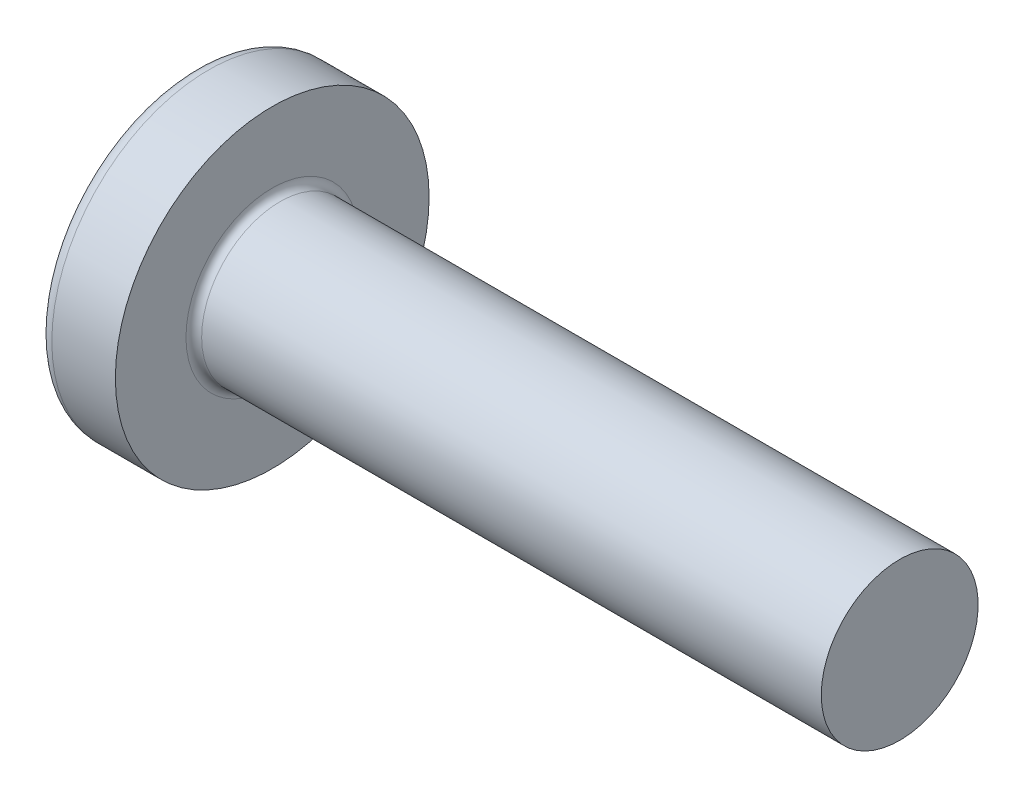
ISO-10303-21;
HEADER;
FILE_DESCRIPTION(('STEP AP214'),'2;1');
FILE_NAME('part.step','',(''),(''),'','','');
FILE_SCHEMA(('AUTOMOTIVE_DESIGN { 1 0 10303 214 1 1 1 1 }'));
ENDSEC;
DATA;
#1=APPLICATION_CONTEXT('core data for automotive mechanical design processes');
#2=APPLICATION_PROTOCOL_DEFINITION('international standard','automotive_design',2000,#1);
#3=PRODUCT_CONTEXT('',#1,'mechanical');
#4=PRODUCT('Part','Part','',(#3));
#5=PRODUCT_RELATED_PRODUCT_CATEGORY('part','',(#4));
#6=PRODUCT_DEFINITION_FORMATION('','',#4);
#7=PRODUCT_DEFINITION_CONTEXT('part definition',#1,'design');
#8=PRODUCT_DEFINITION('design','',#6,#7);
#9=PRODUCT_DEFINITION_SHAPE('','',#8);
#10=(LENGTH_UNIT() NAMED_UNIT(*) SI_UNIT(.MILLI.,.METRE.));
#11=(NAMED_UNIT(*) PLANE_ANGLE_UNIT() SI_UNIT($,.RADIAN.));
#12=(NAMED_UNIT(*) SI_UNIT($,.STERADIAN.) SOLID_ANGLE_UNIT());
#13=UNCERTAINTY_MEASURE_WITH_UNIT(LENGTH_MEASURE(1.E-05),#10,'distance_accuracy_value','');
#14=(GEOMETRIC_REPRESENTATION_CONTEXT(3) GLOBAL_UNCERTAINTY_ASSIGNED_CONTEXT((#13)) GLOBAL_UNIT_ASSIGNED_CONTEXT((#10,
#11,#12)) REPRESENTATION_CONTEXT('',''));
#15=CARTESIAN_POINT('',(0.,0.,0.));
#16=DIRECTION('',(0.,0.,1.));
#17=DIRECTION('',(1.,0.,0.));
#18=AXIS2_PLACEMENT_3D('',#15,#16,#17);
#19=CARTESIAN_POINT('',(3.2,0.,0.));
#20=DIRECTION('',(-1.,0.,0.));
#21=DIRECTION('',(0.,1.,0.));
#22=AXIS2_PLACEMENT_3D('',#19,#20,#21);
#23=SPHERICAL_SURFACE('',#22,3.2);
#24=CARTESIAN_POINT('',(0.646379599446113,0.,0.));
#25=DIRECTION('',(-1.,0.,0.));
#26=DIRECTION('',(0.,0.,1.));
#27=AXIS2_PLACEMENT_3D('',#24,#25,#26);
#28=CIRCLE('',#27,1.92847682119205);
#29=CARTESIAN_POINT('',(0.646379599446113,0.,1.92847682119205));
#30=VERTEX_POINT('',#29);
#31=EDGE_CURVE('E237',#30,#30,#28,.T.);
#32=ORIENTED_EDGE('',*,*,#31,.T.);
#33=EDGE_LOOP('',(#32));
#34=FACE_BOUND('',#33,.T.);
#35=CARTESIAN_POINT('',(0.0321614467928854,0.,0.));
#36=DIRECTION('',(1.,0.,0.));
#37=DIRECTION('',(0.,0.,-1.));
#38=AXIS2_PLACEMENT_3D('',#35,#36,#37);
#39=CIRCLE('',#38,0.452547125518057);
#40=CARTESIAN_POINT('',(0.0321614467928861,-0.239999999999998,-0.38366508938742));
#41=VERTEX_POINT('',#40);
#42=CARTESIAN_POINT('',(0.0321614467928854,-0.383665089387419,-0.24));
#43=VERTEX_POINT('',#42);
#44=EDGE_CURVE('E373',#41,#43,#39,.F.);
#45=ORIENTED_EDGE('',*,*,#44,.F.);
#46=CARTESIAN_POINT('',(3.2,-0.24,0.));
#47=DIRECTION('',(0.,1.,0.));
#48=DIRECTION('',(0.,0.,1.));
#49=AXIS2_PLACEMENT_3D('',#46,#47,#48);
#50=CIRCLE('',#49,3.19098730802866);
#51=CARTESIAN_POINT('',(0.160076673366103,-0.239999999999996,-0.970188728128244));
#52=VERTEX_POINT('',#51);
#53=EDGE_CURVE('E299',#52,#41,#50,.T.);
#54=ORIENTED_EDGE('',*,*,#53,.F.);
#55=CARTESIAN_POINT('',(2.98218780828175,0.,0.436863744320002));
#56=DIRECTION('',(0.446197753347436,0.,-0.894934391398443));
#57=DIRECTION('',(-0.894934391398442,0.,-0.446197753347436));
#58=AXIS2_PLACEMENT_3D('',#55,#56,#57);
#59=CIRCLE('',#58,3.16254769419176);
#60=CARTESIAN_POINT('',(0.160076673366103,0.240000000000003,-0.970188728128242));
#61=VERTEX_POINT('',#60);
#62=EDGE_CURVE('E271',#52,#61,#59,.T.);
#63=ORIENTED_EDGE('',*,*,#62,.T.);
#64=CARTESIAN_POINT('',(3.2,0.24,0.));
#65=DIRECTION('',(0.,-1.,0.));
#66=DIRECTION('',(0.,0.,-1.));
#67=AXIS2_PLACEMENT_3D('',#64,#65,#66);
#68=CIRCLE('',#67,3.19098730802866);
#69=CARTESIAN_POINT('',(0.0321614467928856,0.240000000000001,-0.383665089387418));
#70=VERTEX_POINT('',#69);
#71=EDGE_CURVE('E326',#70,#61,#68,.T.);
#72=ORIENTED_EDGE('',*,*,#71,.F.);
#73=CARTESIAN_POINT('',(0.0321614467928854,0.383665089387417,-0.24));
#74=VERTEX_POINT('',#73);
#75=EDGE_CURVE('E392',#74,#70,#39,.F.);
#76=ORIENTED_EDGE('',*,*,#75,.F.);
#77=CARTESIAN_POINT('',(3.2,0.,-0.24));
#78=DIRECTION('',(0.,0.,1.));
#79=DIRECTION('',(1.,0.,0.));
#80=AXIS2_PLACEMENT_3D('',#77,#78,#79);
#81=CIRCLE('',#80,3.19098730802866);
#82=CARTESIAN_POINT('',(0.160076673366104,0.970188728128243,-0.24));
#83=VERTEX_POINT('',#82);
#84=EDGE_CURVE('E265',#83,#74,#81,.T.);
#85=ORIENTED_EDGE('',*,*,#84,.F.);
#86=CARTESIAN_POINT('',(2.98218780828175,-0.436863744320003,0.));
#87=DIRECTION('',(0.446197753347436,0.894934391398443,0.));
#88=DIRECTION('',(-0.894934391398443,0.446197753347436,0.));
#89=AXIS2_PLACEMENT_3D('',#86,#87,#88);
#90=CIRCLE('',#89,3.16254769419176);
#91=CARTESIAN_POINT('',(0.160076673366104,0.970188728128243,0.24));
#92=VERTEX_POINT('',#91);
#93=EDGE_CURVE('E268',#83,#92,#90,.T.);
#94=ORIENTED_EDGE('',*,*,#93,.T.);
#95=CARTESIAN_POINT('',(3.2,0.,0.24));
#96=DIRECTION('',(0.,0.,-1.));
#97=DIRECTION('',(0.,1.,0.));
#98=AXIS2_PLACEMENT_3D('',#95,#96,#97);
#99=CIRCLE('',#98,3.19098730802866);
#100=CARTESIAN_POINT('',(0.0321614467928856,0.383665089387416,0.24));
#101=VERTEX_POINT('',#100);
#102=EDGE_CURVE('E261',#101,#92,#99,.T.);
#103=ORIENTED_EDGE('',*,*,#102,.F.);
#104=CARTESIAN_POINT('',(0.0321614467928855,0.239999999999999,0.38366508938742));
#105=VERTEX_POINT('',#104);
#106=EDGE_CURVE('E391',#105,#101,#39,.F.);
#107=ORIENTED_EDGE('',*,*,#106,.F.);
#108=CARTESIAN_POINT('',(0.160076673366103,0.239999999999997,0.970188728128244));
#109=VERTEX_POINT('',#108);
#110=EDGE_CURVE('E281',#109,#105,#68,.T.);
#111=ORIENTED_EDGE('',*,*,#110,.F.);
#112=CARTESIAN_POINT('',(2.98218780828175,0.,-0.436863744320003));
#113=DIRECTION('',(0.446197753347436,0.,0.894934391398443));
#114=DIRECTION('',(0.894934391398443,0.,-0.446197753347436));
#115=AXIS2_PLACEMENT_3D('',#112,#113,#114);
#116=CIRCLE('',#115,3.16254769419176);
#117=CARTESIAN_POINT('',(0.160076673366103,-0.240000000000003,0.970188728128242));
#118=VERTEX_POINT('',#117);
#119=EDGE_CURVE('E48',#109,#118,#116,.T.);
#120=ORIENTED_EDGE('',*,*,#119,.T.);
#121=CARTESIAN_POINT('',(0.0321614467928861,-0.240000000000001,0.383665089387418));
#122=VERTEX_POINT('',#121);
#123=EDGE_CURVE('E278',#122,#118,#50,.T.);
#124=ORIENTED_EDGE('',*,*,#123,.F.);
#125=CARTESIAN_POINT('',(0.0321614467928856,-0.383665089387418,0.24));
#126=VERTEX_POINT('',#125);
#127=EDGE_CURVE('E427',#126,#122,#39,.F.);
#128=ORIENTED_EDGE('',*,*,#127,.F.);
#129=CARTESIAN_POINT('',(0.160076673366103,-0.970188728128243,0.24));
#130=VERTEX_POINT('',#129);
#131=EDGE_CURVE('E262',#130,#126,#99,.T.);
#132=ORIENTED_EDGE('',*,*,#131,.F.);
#133=CARTESIAN_POINT('',(2.98218780828175,0.436863744320002,0.));
#134=DIRECTION('',(0.446197753347436,-0.894934391398443,0.));
#135=DIRECTION('',(0.894934391398442,0.446197753347436,0.));
#136=AXIS2_PLACEMENT_3D('',#133,#134,#135);
#137=CIRCLE('',#136,3.16254769419176);
#138=CARTESIAN_POINT('',(0.160076673366103,-0.970188728128243,-0.24));
#139=VERTEX_POINT('',#138);
#140=EDGE_CURVE('E258',#130,#139,#137,.T.);
#141=ORIENTED_EDGE('',*,*,#140,.T.);
#142=EDGE_CURVE('E63',#43,#139,#81,.T.);
#143=ORIENTED_EDGE('',*,*,#142,.F.);
#144=EDGE_LOOP('',(#45,#54,#63,#72,#76,#85,#94,#103,#107,#111,#120,#124,#128,#132,#141,#143));
#145=FACE_BOUND('',#144,.T.);
#146=ADVANCED_FACE('F35',(#34,#145),#23,.T.);
#147=CARTESIAN_POINT('',(1.42,0.342014234961647,-0.24));
#148=DIRECTION('',(0.,0.,1.));
#149=DIRECTION('',(1.,0.,0.));
#150=AXIS2_PLACEMENT_3D('',#147,#148,#149);
#151=PLANE('',#150);
#152=ORIENTED_EDGE('',*,*,#84,.T.);
#153=CARTESIAN_POINT('',(-0.626811087646333,0.437068483432734,-0.24));
#154=CARTESIAN_POINT('',(-0.489788496188268,0.426133650699674,-0.24));
#155=CARTESIAN_POINT('',(-0.35277275089666,0.415111501640761,-0.24));
#156=CARTESIAN_POINT('',(-0.078757882964478,0.392826208775377,-0.24));
#157=CARTESIAN_POINT('',(0.0582412392502161,0.381563059737591,-0.24));
#158=CARTESIAN_POINT('',(0.332213907654152,0.358729879929546,-0.24));
#159=CARTESIAN_POINT('',(0.469187453856035,0.347159849311357,-0.24));
#160=CARTESIAN_POINT('',(0.743097225439297,0.323608060039765,-0.24));
#161=CARTESIAN_POINT('',(0.880033451350377,0.311626307573655,-0.24));
#162=CARTESIAN_POINT('',(1.12503843743479,0.289667437089413,-0.24));
#163=CARTESIAN_POINT('',(1.23311691792,0.279799173776849,-0.24));
#164=CARTESIAN_POINT('',(1.4492267018282,0.259570129968442,-0.24));
#165=CARTESIAN_POINT('',(1.55725800577256,0.249209355061897,-0.24));
#166=CARTESIAN_POINT('',(1.77325939831777,0.227783788850472,-0.24));
#167=CARTESIAN_POINT('',(1.88122948205844,0.216718947894399,-0.24));
#168=CARTESIAN_POINT('',(2.04309848476113,0.199296215271932,-0.24));
#169=CARTESIAN_POINT('',(2.09704158415864,0.193350927204474,-0.24));
#170=CARTESIAN_POINT('',(2.20488609252136,0.181086542764125,-0.24));
#171=CARTESIAN_POINT('',(2.25878750075649,0.174767439988846,-0.24));
#172=CARTESIAN_POINT('',(2.31266102213859,0.168212174791089,-0.24));
#173=B_SPLINE_CURVE_WITH_KNOTS('',3,(#153,#154,#155,#156,#157,#158,#159,#160,#161,#162,#163,
#164,#165,#166,#167,#168,#169,#170,#171,#172),.UNSPECIFIED.,.F.,.F.,(4,2,2,2,2,2,2,2,2,4),(0.,
0.412374804430943,0.824758569256476,1.23714212973639,1.64951949568622,1.97510284899868,
2.30068250829037,2.62628515317116,2.78909323564388,2.95190410736571),.UNSPECIFIED.);
#174=CARTESIAN_POINT('',(1.42,0.262259890185288,-0.240000000000001));
#175=VERTEX_POINT('',#174);
#176=EDGE_CURVE('E413',#74,#175,#173,.T.);
#177=ORIENTED_EDGE('',*,*,#176,.T.);
#178=DIRECTION('',(0.,1.,0.));
#179=VECTOR('',#178,1.);
#180=CARTESIAN_POINT('',(1.42,-0.342014234961648,-0.24));
#181=LINE('',#180,#179);
#182=CARTESIAN_POINT('',(1.42,0.342014234961647,-0.24));
#183=VERTEX_POINT('',#182);
#184=EDGE_CURVE('E355',#175,#183,#181,.T.);
#185=ORIENTED_EDGE('',*,*,#184,.T.);
#186=DIRECTION('',(0.894934391398442,-0.446197753347436,0.));
#187=VECTOR('',#186,1.);
#188=CARTESIAN_POINT('',(0.,1.05,-0.24));
#189=LINE('',#188,#187);
#190=EDGE_CURVE('E238',#83,#183,#189,.T.);
#191=ORIENTED_EDGE('',*,*,#190,.F.);
#192=EDGE_LOOP('',(#152,#177,#185,#191));
#193=FACE_BOUND('',#192,.T.);
#194=ADVANCED_FACE('F193',(#193),#151,.T.);
#195=CARTESIAN_POINT('',(1.42,-0.342014234961648,-0.24));
#196=VERTEX_POINT('',#195);
#197=CARTESIAN_POINT('',(1.42,-0.262259890185288,-0.240000000000001));
#198=VERTEX_POINT('',#197);
#199=EDGE_CURVE('E246',#196,#198,#181,.T.);
#200=ORIENTED_EDGE('',*,*,#199,.T.);
#201=CARTESIAN_POINT('',(-0.626811087646333,-0.437068483432734,-0.24));
#202=CARTESIAN_POINT('',(-0.489788496188268,-0.426133650699674,-0.24));
#203=CARTESIAN_POINT('',(-0.35277275089666,-0.415111501640761,-0.24));
#204=CARTESIAN_POINT('',(-0.078757882964478,-0.392826208775377,-0.24));
#205=CARTESIAN_POINT('',(0.0582412392502161,-0.381563059737591,-0.24));
#206=CARTESIAN_POINT('',(0.332213907654152,-0.358729879929546,-0.24));
#207=CARTESIAN_POINT('',(0.469187453856035,-0.347159849311357,-0.24));
#208=CARTESIAN_POINT('',(0.743097225439297,-0.323608060039765,-0.24));
#209=CARTESIAN_POINT('',(0.880033451350377,-0.311626307573655,-0.24));
#210=CARTESIAN_POINT('',(1.12503843743479,-0.289667437089413,-0.24));
#211=CARTESIAN_POINT('',(1.23311691792,-0.279799173776849,-0.24));
#212=CARTESIAN_POINT('',(1.4492267018282,-0.259570129968442,-0.24));
#213=CARTESIAN_POINT('',(1.55725800577256,-0.249209355061897,-0.24));
#214=CARTESIAN_POINT('',(1.77325939831777,-0.227783788850472,-0.24));
#215=CARTESIAN_POINT('',(1.88122948205844,-0.216718947894399,-0.24));
#216=CARTESIAN_POINT('',(2.04309848476113,-0.199296215271932,-0.24));
#217=CARTESIAN_POINT('',(2.09704158415864,-0.193350927204474,-0.24));
#218=CARTESIAN_POINT('',(2.20488609252136,-0.181086542764125,-0.24));
#219=CARTESIAN_POINT('',(2.25878750075649,-0.174767439988846,-0.24));
#220=CARTESIAN_POINT('',(2.31266102213859,-0.168212174791089,-0.24));
#221=B_SPLINE_CURVE_WITH_KNOTS('',3,(#201,#202,#203,#204,#205,#206,#207,#208,#209,#210,#211,
#212,#213,#214,#215,#216,#217,#218,#219,#220),.UNSPECIFIED.,.F.,.F.,(4,2,2,2,2,2,2,2,2,4),(0.,
0.412374804430943,0.824758569256476,1.23714212973639,1.64951949568622,1.97510284899868,
2.30068250829037,2.62628515317116,2.78909323564388,2.95190410736571),.UNSPECIFIED.);
#222=EDGE_CURVE('E390',#198,#43,#221,.F.);
#223=ORIENTED_EDGE('',*,*,#222,.T.);
#224=ORIENTED_EDGE('',*,*,#142,.T.);
#225=DIRECTION('',(0.894934391398442,0.446197753347436,0.));
#226=VECTOR('',#225,1.);
#227=CARTESIAN_POINT('',(0.,-1.05,-0.24));
#228=LINE('',#227,#226);
#229=EDGE_CURVE('E329',#139,#196,#228,.T.);
#230=ORIENTED_EDGE('',*,*,#229,.T.);
#231=EDGE_LOOP('',(#200,#223,#224,#230));
#232=FACE_BOUND('',#231,.T.);
#233=ADVANCED_FACE('F199',(#232),#151,.T.);
#234=CARTESIAN_POINT('',(1.42,-0.342014234961647,0.24));
#235=DIRECTION('',(0.,0.,-1.));
#236=DIRECTION('',(0.,1.,0.));
#237=AXIS2_PLACEMENT_3D('',#234,#235,#236);
#238=PLANE('',#237);
#239=DIRECTION('',(0.,-1.,0.));
#240=VECTOR('',#239,1.);
#241=CARTESIAN_POINT('',(1.42,0.342014234961647,0.24));
#242=LINE('',#241,#240);
#243=CARTESIAN_POINT('',(1.42,0.342014234961647,0.24));
#244=VERTEX_POINT('',#243);
#245=CARTESIAN_POINT('',(1.42,0.262259890185288,0.240000000000001));
#246=VERTEX_POINT('',#245);
#247=EDGE_CURVE('E338',#244,#246,#242,.T.);
#248=ORIENTED_EDGE('',*,*,#247,.T.);
#249=CARTESIAN_POINT('',(-0.62681108769363,0.437068483436507,0.24));
#250=CARTESIAN_POINT('',(-0.489788496230297,0.426133650703048,0.24));
#251=CARTESIAN_POINT('',(-0.352772750933422,0.415111501643733,0.24));
#252=CARTESIAN_POINT('',(-0.0787578829907056,0.392826208777529,0.24));
#253=CARTESIAN_POINT('',(0.0582412392292552,0.381563059739326,0.24));
#254=CARTESIAN_POINT('',(0.332213907649304,0.358729879929962,0.24));
#255=CARTESIAN_POINT('',(0.46918745386203,0.347159849310859,0.24));
#256=CARTESIAN_POINT('',(0.743097225466975,0.323608060037368,0.24));
#257=CARTESIAN_POINT('',(0.880033451388893,0.311626307570274,0.24));
#258=CARTESIAN_POINT('',(1.12503843748414,0.289667437084935,0.24));
#259=CARTESIAN_POINT('',(1.23311691796934,0.279799173772307,0.24));
#260=CARTESIAN_POINT('',(1.44922670187753,0.259570129963748,0.24));
#261=CARTESIAN_POINT('',(1.55725800582188,0.249209355057115,0.24));
#262=CARTESIAN_POINT('',(1.77325939836707,0.227783788845471,0.24));
#263=CARTESIAN_POINT('',(1.88122948210773,0.216718947889267,0.24));
#264=CARTESIAN_POINT('',(2.0430984848104,0.199296215266543,0.24));
#265=CARTESIAN_POINT('',(2.0970415842079,0.193350927198989,0.24));
#266=CARTESIAN_POINT('',(2.20488609257059,0.181086542758413,0.24));
#267=CARTESIAN_POINT('',(2.25878750080571,0.174767439983005,0.24));
#268=CARTESIAN_POINT('',(2.31266102218779,0.168212174785094,0.24));
#269=B_SPLINE_CURVE_WITH_KNOTS('',3,(#249,#250,#251,#252,#253,#254,#255,#256,#257,#258,#259,
#260,#261,#262,#263,#264,#265,#266,#267,#268),.UNSPECIFIED.,.F.,.F.,(4,2,2,2,2,2,2,2,2,4),(0.,
0.412374804446791,0.824758569288173,1.23714212980074,1.64951949578321,1.97510284909568,
2.30068250838736,2.62628515326816,2.78909323574088,2.95190410746272),.UNSPECIFIED.);
#270=EDGE_CURVE('E665',#246,#101,#269,.F.);
#271=ORIENTED_EDGE('',*,*,#270,.T.);
#272=ORIENTED_EDGE('',*,*,#102,.T.);
#273=DIRECTION('',(0.894934391398442,-0.446197753347436,0.));
#274=VECTOR('',#273,1.);
#275=CARTESIAN_POINT('',(0.,1.05,0.24));
#276=LINE('',#275,#274);
#277=EDGE_CURVE('E243',#92,#244,#276,.T.);
#278=ORIENTED_EDGE('',*,*,#277,.T.);
#279=EDGE_LOOP('',(#248,#271,#272,#278));
#280=FACE_BOUND('',#279,.T.);
#281=ADVANCED_FACE('F409',(#280),#238,.T.);
#282=ORIENTED_EDGE('',*,*,#131,.T.);
#283=CARTESIAN_POINT('',(-0.62681108769363,-0.437068483436507,0.24));
#284=CARTESIAN_POINT('',(-0.489788496230297,-0.426133650703048,0.24));
#285=CARTESIAN_POINT('',(-0.352772750933422,-0.415111501643733,0.24));
#286=CARTESIAN_POINT('',(-0.0787578829907059,-0.392826208777529,0.24));
#287=CARTESIAN_POINT('',(0.058241239229255,-0.381563059739326,0.24));
#288=CARTESIAN_POINT('',(0.332213907649304,-0.358729879929962,0.24));
#289=CARTESIAN_POINT('',(0.46918745386203,-0.347159849310859,0.24));
#290=CARTESIAN_POINT('',(0.743097225466975,-0.323608060037368,0.24));
#291=CARTESIAN_POINT('',(0.880033451388893,-0.311626307570274,0.24));
#292=CARTESIAN_POINT('',(1.12503843748414,-0.289667437084935,0.24));
#293=CARTESIAN_POINT('',(1.23311691796934,-0.279799173772307,0.24));
#294=CARTESIAN_POINT('',(1.44922670187753,-0.259570129963748,0.24));
#295=CARTESIAN_POINT('',(1.55725800582188,-0.249209355057115,0.24));
#296=CARTESIAN_POINT('',(1.77325939836707,-0.227783788845471,0.24));
#297=CARTESIAN_POINT('',(1.88122948210773,-0.216718947889267,0.24));
#298=CARTESIAN_POINT('',(2.0430984848104,-0.199296215266543,0.24));
#299=CARTESIAN_POINT('',(2.0970415842079,-0.193350927198989,0.24));
#300=CARTESIAN_POINT('',(2.20488609257059,-0.181086542758413,0.24));
#301=CARTESIAN_POINT('',(2.25878750080571,-0.174767439983005,0.24));
#302=CARTESIAN_POINT('',(2.31266102218779,-0.168212174785094,0.24));
#303=B_SPLINE_CURVE_WITH_KNOTS('',3,(#283,#284,#285,#286,#287,#288,#289,#290,#291,#292,#293,
#294,#295,#296,#297,#298,#299,#300,#301,#302),.UNSPECIFIED.,.F.,.F.,(4,2,2,2,2,2,2,2,2,4),(0.,
0.412374804446791,0.824758569288173,1.23714212980074,1.64951949578321,1.97510284909568,
2.30068250838736,2.62628515326816,2.78909323574088,2.95190410746272),.UNSPECIFIED.);
#304=CARTESIAN_POINT('',(1.42,-0.262259890185289,0.240000000000001));
#305=VERTEX_POINT('',#304);
#306=EDGE_CURVE('E428',#126,#305,#303,.T.);
#307=ORIENTED_EDGE('',*,*,#306,.T.);
#308=CARTESIAN_POINT('',(1.42,-0.342014234961648,0.24));
#309=VERTEX_POINT('',#308);
#310=EDGE_CURVE('E340',#305,#309,#242,.T.);
#311=ORIENTED_EDGE('',*,*,#310,.T.);
#312=DIRECTION('',(0.894934391398442,0.446197753347436,0.));
#313=VECTOR('',#312,1.);
#314=CARTESIAN_POINT('',(0.,-1.05,0.24));
#315=LINE('',#314,#313);
#316=EDGE_CURVE('E331',#130,#309,#315,.T.);
#317=ORIENTED_EDGE('',*,*,#316,.F.);
#318=EDGE_LOOP('',(#282,#307,#311,#317));
#319=FACE_BOUND('',#318,.T.);
#320=ADVANCED_FACE('F513',(#319),#238,.T.);
#321=CARTESIAN_POINT('',(0.,1.05,0.24));
#322=DIRECTION('',(0.446197753347436,0.894934391398443,0.));
#323=DIRECTION('',(-0.894934391398443,0.446197753347436,0.));
#324=AXIS2_PLACEMENT_3D('',#321,#322,#323);
#325=PLANE('',#324);
#326=CARTESIAN_POINT('',(2.01772965253961,0.0439972734550525,0.));
#327=DIRECTION('',(0.446197753347436,0.894934391398443,0.));
#328=DIRECTION('',(-0.894934391398443,0.446197753347436,0.));
#329=AXIS2_PLACEMENT_3D('',#326,#327,#328);
#330=ELLIPSE('',#329,0.703057486597294,0.310602005333466);
#331=CARTESIAN_POINT('',(1.42,0.342014234961648,0.0969871799961127));
#332=VERTEX_POINT('',#331);
#333=CARTESIAN_POINT('',(1.42,0.342014234961648,-0.0969871799961128));
#334=VERTEX_POINT('',#333);
#335=EDGE_CURVE('E304',#332,#334,#330,.F.);
#336=ORIENTED_EDGE('',*,*,#335,.F.);
#337=DIRECTION('',(0.,0.,-1.));
#338=VECTOR('',#337,1.);
#339=CARTESIAN_POINT('',(1.42,0.342014234961647,0.24));
#340=LINE('',#339,#338);
#341=EDGE_CURVE('E341',#244,#332,#340,.T.);
#342=ORIENTED_EDGE('',*,*,#341,.F.);
#343=ORIENTED_EDGE('',*,*,#277,.F.);
#344=ORIENTED_EDGE('',*,*,#93,.F.);
#345=ORIENTED_EDGE('',*,*,#190,.T.);
#346=EDGE_CURVE('E343',#334,#183,#340,.T.);
#347=ORIENTED_EDGE('',*,*,#346,.F.);
#348=EDGE_LOOP('',(#336,#342,#343,#344,#345,#347));
#349=FACE_BOUND('',#348,.T.);
#350=ADVANCED_FACE('F407',(#349),#325,.F.);
#351=CARTESIAN_POINT('',(0.,-1.05,-0.24));
#352=DIRECTION('',(0.446197753347436,-0.894934391398443,0.));
#353=DIRECTION('',(0.894934391398442,0.446197753347436,0.));
#354=AXIS2_PLACEMENT_3D('',#351,#352,#353);
#355=PLANE('',#354);
#356=CARTESIAN_POINT('',(2.01772965253961,-0.0439972734550525,0.));
#357=DIRECTION('',(0.446197753347436,-0.894934391398443,0.));
#358=DIRECTION('',(-0.894934391398443,-0.446197753347436,0.));
#359=AXIS2_PLACEMENT_3D('',#356,#357,#358);
#360=ELLIPSE('',#359,0.703057486597294,0.310602005333466);
#361=CARTESIAN_POINT('',(1.42,-0.342014234961649,-0.0969871799961111));
#362=VERTEX_POINT('',#361);
#363=CARTESIAN_POINT('',(1.42,-0.342014234961649,0.096987179996111));
#364=VERTEX_POINT('',#363);
#365=EDGE_CURVE('E667',#362,#364,#360,.F.);
#366=ORIENTED_EDGE('',*,*,#365,.F.);
#367=DIRECTION('',(0.,0.,1.));
#368=VECTOR('',#367,1.);
#369=CARTESIAN_POINT('',(1.42,-0.342014234961648,-0.24));
#370=LINE('',#369,#368);
#371=EDGE_CURVE('E334',#196,#362,#370,.T.);
#372=ORIENTED_EDGE('',*,*,#371,.F.);
#373=ORIENTED_EDGE('',*,*,#229,.F.);
#374=ORIENTED_EDGE('',*,*,#140,.F.);
#375=ORIENTED_EDGE('',*,*,#316,.T.);
#376=EDGE_CURVE('E337',#364,#309,#370,.T.);
#377=ORIENTED_EDGE('',*,*,#376,.F.);
#378=EDGE_LOOP('',(#366,#372,#373,#374,#375,#377));
#379=FACE_BOUND('',#378,.T.);
#380=ADVANCED_FACE('F500',(#379),#355,.F.);
#381=CARTESIAN_POINT('',(1.42,0.342014234961647,-0.24));
#382=DIRECTION('',(-1.,0.,0.));
#383=DIRECTION('',(0.,0.,1.));
#384=AXIS2_PLACEMENT_3D('',#381,#382,#383);
#385=PLANE('',#384);
#386=DIRECTION('',(0.,1.,0.));
#387=VECTOR('',#386,1.);
#388=CARTESIAN_POINT('',(1.42,-0.240000000000001,0.342014234961646));
#389=LINE('',#388,#387);
#390=CARTESIAN_POINT('',(1.42,-0.240000000000001,0.342014234961646));
#391=VERTEX_POINT('',#390);
#392=CARTESIAN_POINT('',(1.42,-0.096987179996118,0.342014234961647));
#393=VERTEX_POINT('',#392);
#394=EDGE_CURVE('E319',#391,#393,#389,.T.);
#395=ORIENTED_EDGE('',*,*,#394,.T.);
#396=CARTESIAN_POINT('',(1.42,0.,0.));
#397=DIRECTION('',(-1.,0.,0.));
#398=DIRECTION('',(0.,0.,1.));
#399=AXIS2_PLACEMENT_3D('',#396,#397,#398);
#400=CIRCLE('',#399,0.3555);
#401=CARTESIAN_POINT('',(1.42,-0.240000000000001,0.262259890185288));
#402=VERTEX_POINT('',#401);
#403=EDGE_CURVE('E693',#402,#393,#400,.T.);
#404=ORIENTED_EDGE('',*,*,#403,.F.);
#405=DIRECTION('',(0.,0.,-1.));
#406=VECTOR('',#405,1.);
#407=CARTESIAN_POINT('',(1.42,-0.240000000000001,0.342014234961646));
#408=LINE('',#407,#406);
#409=EDGE_CURVE('E315',#391,#402,#408,.T.);
#410=ORIENTED_EDGE('',*,*,#409,.F.);
#411=EDGE_LOOP('',(#395,#404,#410));
#412=FACE_BOUND('',#411,.T.);
#413=ADVANCED_FACE('F493',(#412),#385,.T.);
#414=ORIENTED_EDGE('',*,*,#310,.F.);
#415=EDGE_CURVE('E698',#364,#305,#400,.T.);
#416=ORIENTED_EDGE('',*,*,#415,.F.);
#417=ORIENTED_EDGE('',*,*,#376,.T.);
#418=EDGE_LOOP('',(#414,#416,#417));
#419=FACE_BOUND('',#418,.T.);
#420=ADVANCED_FACE('F486',(#419),#385,.T.);
#421=ORIENTED_EDGE('',*,*,#371,.T.);
#422=EDGE_CURVE('E384',#198,#362,#400,.T.);
#423=ORIENTED_EDGE('',*,*,#422,.F.);
#424=ORIENTED_EDGE('',*,*,#199,.F.);
#425=EDGE_LOOP('',(#421,#423,#424));
#426=FACE_BOUND('',#425,.T.);
#427=ADVANCED_FACE('F480',(#426),#385,.T.);
#428=CARTESIAN_POINT('',(1.42,-0.239999999999999,-0.262259890185288));
#429=VERTEX_POINT('',#428);
#430=CARTESIAN_POINT('',(1.42,-0.239999999999999,-0.342014234961648));
#431=VERTEX_POINT('',#430);
#432=EDGE_CURVE('E318',#429,#431,#408,.T.);
#433=ORIENTED_EDGE('',*,*,#432,.F.);
#434=CARTESIAN_POINT('',(1.42,-0.0969871799961141,-0.342014234961648));
#435=VERTEX_POINT('',#434);
#436=EDGE_CURVE('E55',#435,#429,#400,.T.);
#437=ORIENTED_EDGE('',*,*,#436,.F.);
#438=DIRECTION('',(0.,-1.,0.));
#439=VECTOR('',#438,1.);
#440=CARTESIAN_POINT('',(1.42,0.240000000000001,-0.342014234961647));
#441=LINE('',#440,#439);
#442=EDGE_CURVE('E314',#435,#431,#441,.T.);
#443=ORIENTED_EDGE('',*,*,#442,.T.);
#444=EDGE_LOOP('',(#433,#437,#443));
#445=FACE_BOUND('',#444,.T.);
#446=ADVANCED_FACE('F379',(#445),#385,.T.);
#447=CARTESIAN_POINT('',(1.42,0.240000000000001,-0.342014234961647));
#448=VERTEX_POINT('',#447);
#449=CARTESIAN_POINT('',(1.42,0.0969871799961165,-0.342014234961647));
#450=VERTEX_POINT('',#449);
#451=EDGE_CURVE('E311',#448,#450,#441,.T.);
#452=ORIENTED_EDGE('',*,*,#451,.T.);
#453=CARTESIAN_POINT('',(1.42,0.240000000000001,-0.262259890185288));
#454=VERTEX_POINT('',#453);
#455=EDGE_CURVE('E383',#454,#450,#400,.T.);
#456=ORIENTED_EDGE('',*,*,#455,.F.);
#457=DIRECTION('',(0.,0.,1.));
#458=VECTOR('',#457,1.);
#459=CARTESIAN_POINT('',(1.42,0.240000000000001,-0.342014234961647));
#460=LINE('',#459,#458);
#461=EDGE_CURVE('E323',#448,#454,#460,.T.);
#462=ORIENTED_EDGE('',*,*,#461,.F.);
#463=EDGE_LOOP('',(#452,#456,#462));
#464=FACE_BOUND('',#463,.T.);
#465=ADVANCED_FACE('F468',(#464),#385,.T.);
#466=ORIENTED_EDGE('',*,*,#184,.F.);
#467=EDGE_CURVE('E682',#334,#175,#400,.T.);
#468=ORIENTED_EDGE('',*,*,#467,.F.);
#469=ORIENTED_EDGE('',*,*,#346,.T.);
#470=EDGE_LOOP('',(#466,#468,#469));
#471=FACE_BOUND('',#470,.T.);
#472=ADVANCED_FACE('F461',(#471),#385,.T.);
#473=ORIENTED_EDGE('',*,*,#341,.T.);
#474=EDGE_CURVE('E684',#246,#332,#400,.T.);
#475=ORIENTED_EDGE('',*,*,#474,.F.);
#476=ORIENTED_EDGE('',*,*,#247,.F.);
#477=EDGE_LOOP('',(#473,#475,#476));
#478=FACE_BOUND('',#477,.T.);
#479=ADVANCED_FACE('F455',(#478),#385,.T.);
#480=CARTESIAN_POINT('',(1.42,0.239999999999999,0.342014234961648));
#481=DIRECTION('',(0.,-1.,0.));
#482=DIRECTION('',(1.,0.,0.));
#483=AXIS2_PLACEMENT_3D('',#480,#481,#482);
#484=PLANE('',#483);
#485=ORIENTED_EDGE('',*,*,#110,.T.);
#486=CARTESIAN_POINT('',(-0.626811087646333,0.239999999999998,0.437068483432735));
#487=CARTESIAN_POINT('',(-0.489788496188268,0.239999999999999,0.426133650699675));
#488=CARTESIAN_POINT('',(-0.35277275089666,0.239999999999999,0.415111501640762));
#489=CARTESIAN_POINT('',(-0.078757882964478,0.239999999999999,0.392826208775378));
#490=CARTESIAN_POINT('',(0.0582412392502161,0.239999999999999,0.381563059737592));
#491=CARTESIAN_POINT('',(0.332213907654152,0.239999999999999,0.358729879929547));
#492=CARTESIAN_POINT('',(0.469187453856035,0.239999999999999,0.347159849311358));
#493=CARTESIAN_POINT('',(0.743097225439297,0.239999999999999,0.323608060039766));
#494=CARTESIAN_POINT('',(0.880033451350377,0.239999999999999,0.311626307573656));
#495=CARTESIAN_POINT('',(1.12503843743479,0.239999999999999,0.289667437089414));
#496=CARTESIAN_POINT('',(1.23311691792,0.239999999999999,0.279799173776849));
#497=CARTESIAN_POINT('',(1.4492267018282,0.239999999999999,0.259570129968442));
#498=CARTESIAN_POINT('',(1.55725800577256,0.239999999999999,0.249209355061898));
#499=CARTESIAN_POINT('',(1.77325939831777,0.239999999999999,0.227783788850473));
#500=CARTESIAN_POINT('',(1.88122948205844,0.239999999999999,0.216718947894399));
#501=CARTESIAN_POINT('',(2.04309848476113,0.239999999999999,0.199296215271933));
#502=CARTESIAN_POINT('',(2.09704158415864,0.239999999999999,0.193350927204475));
#503=CARTESIAN_POINT('',(2.20488609252136,0.239999999999999,0.181086542764126));
#504=CARTESIAN_POINT('',(2.25878750075649,0.239999999999999,0.174767439988847));
#505=CARTESIAN_POINT('',(2.31266102213859,0.239999999999999,0.16821217479109));
#506=B_SPLINE_CURVE_WITH_KNOTS('',3,(#486,#487,#488,#489,#490,#491,#492,#493,#494,#495,#496,
#497,#498,#499,#500,#501,#502,#503,#504,#505),.UNSPECIFIED.,.F.,.F.,(4,2,2,2,2,2,2,2,2,4),(0.,
0.412374804430943,0.824758569256476,1.23714212973639,1.64951949568622,1.97510284899868,
2.30068250829037,2.62628515317116,2.78909323564388,2.95190410736571),.UNSPECIFIED.);
#507=CARTESIAN_POINT('',(1.42,0.239999999999999,0.26225989018529));
#508=VERTEX_POINT('',#507);
#509=EDGE_CURVE('E664',#105,#508,#506,.T.);
#510=ORIENTED_EDGE('',*,*,#509,.T.);
#511=CARTESIAN_POINT('',(1.42,0.239999999999999,0.342014234961648));
#512=VERTEX_POINT('',#511);
#513=EDGE_CURVE('E296',#508,#512,#460,.T.);
#514=ORIENTED_EDGE('',*,*,#513,.T.);
#515=DIRECTION('',(0.894934391398442,0.,-0.446197753347436));
#516=VECTOR('',#515,1.);
#517=CARTESIAN_POINT('',(0.,0.239999999999996,1.05));
#518=LINE('',#517,#516);
#519=EDGE_CURVE('E289',#109,#512,#518,.T.);
#520=ORIENTED_EDGE('',*,*,#519,.F.);
#521=EDGE_LOOP('',(#485,#510,#514,#520));
#522=FACE_BOUND('',#521,.T.);
#523=ADVANCED_FACE('F293',(#522),#484,.T.);
#524=CARTESIAN_POINT('',(1.42,-0.239999999999999,-0.342014234961648));
#525=DIRECTION('',(0.,1.,0.));
#526=DIRECTION('',(0.,0.,1.));
#527=AXIS2_PLACEMENT_3D('',#524,#525,#526);
#528=PLANE('',#527);
#529=ORIENTED_EDGE('',*,*,#409,.T.);
#530=CARTESIAN_POINT('',(-0.62681108769363,-0.240000000000001,0.437068483436506));
#531=CARTESIAN_POINT('',(-0.489788496230297,-0.240000000000001,0.426133650703047));
#532=CARTESIAN_POINT('',(-0.352772750933422,-0.240000000000001,0.415111501643732));
#533=CARTESIAN_POINT('',(-0.0787578829907057,-0.240000000000001,0.392826208777528));
#534=CARTESIAN_POINT('',(0.0582412392292551,-0.240000000000001,0.381563059739325));
#535=CARTESIAN_POINT('',(0.332213907649304,-0.240000000000001,0.358729879929961));
#536=CARTESIAN_POINT('',(0.46918745386203,-0.240000000000001,0.347159849310858));
#537=CARTESIAN_POINT('',(0.743097225466975,-0.240000000000001,0.323608060037367));
#538=CARTESIAN_POINT('',(0.880033451388893,-0.240000000000001,0.311626307570273));
#539=CARTESIAN_POINT('',(1.12503843748414,-0.240000000000001,0.289667437084934));
#540=CARTESIAN_POINT('',(1.23311691796933,-0.240000000000001,0.279799173772306));
#541=CARTESIAN_POINT('',(1.44922670187753,-0.240000000000001,0.259570129963747));
#542=CARTESIAN_POINT('',(1.55725800582188,-0.240000000000001,0.249209355057114));
#543=CARTESIAN_POINT('',(1.77325939836707,-0.240000000000001,0.22778378884547));
#544=CARTESIAN_POINT('',(1.88122948210773,-0.240000000000001,0.216718947889266));
#545=CARTESIAN_POINT('',(2.0430984848104,-0.240000000000001,0.199296215266542));
#546=CARTESIAN_POINT('',(2.0970415842079,-0.240000000000001,0.193350927198988));
#547=CARTESIAN_POINT('',(2.20488609257059,-0.240000000000001,0.181086542758413));
#548=CARTESIAN_POINT('',(2.25878750080571,-0.240000000000001,0.174767439983004));
#549=CARTESIAN_POINT('',(2.31266102218779,-0.240000000000001,0.168212174785094));
#550=B_SPLINE_CURVE_WITH_KNOTS('',3,(#530,#531,#532,#533,#534,#535,#536,#537,#538,#539,#540,
#541,#542,#543,#544,#545,#546,#547,#548,#549),.UNSPECIFIED.,.F.,.F.,(4,2,2,2,2,2,2,2,2,4),(0.,
0.412374804446791,0.824758569288173,1.23714212980074,1.64951949578321,1.97510284909568,
2.30068250838736,2.62628515326816,2.78909323574088,2.95190410746272),.UNSPECIFIED.);
#551=EDGE_CURVE('E421',#402,#122,#550,.F.);
#552=ORIENTED_EDGE('',*,*,#551,.T.);
#553=ORIENTED_EDGE('',*,*,#123,.T.);
#554=DIRECTION('',(0.894934391398442,0.,-0.446197753347436));
#555=VECTOR('',#554,1.);
#556=CARTESIAN_POINT('',(0.,-0.240000000000004,1.05));
#557=LINE('',#556,#555);
#558=EDGE_CURVE('E291',#118,#391,#557,.T.);
#559=ORIENTED_EDGE('',*,*,#558,.T.);
#560=EDGE_LOOP('',(#529,#552,#553,#559));
#561=FACE_BOUND('',#560,.T.);
#562=ADVANCED_FACE('F228',(#561),#528,.T.);
#563=CARTESIAN_POINT('',(0.,-0.240000000000004,1.05));
#564=DIRECTION('',(0.446197753347436,0.,0.894934391398443));
#565=DIRECTION('',(-0.894934391398443,0.,0.446197753347436));
#566=AXIS2_PLACEMENT_3D('',#563,#564,#565);
#567=PLANE('',#566);
#568=CARTESIAN_POINT('',(2.01772965253961,0.,0.0439972734550526));
#569=DIRECTION('',(0.446197753347436,0.,0.894934391398443));
#570=DIRECTION('',(-0.894934391398443,0.,0.446197753347436));
#571=AXIS2_PLACEMENT_3D('',#568,#569,#570);
#572=ELLIPSE('',#571,0.703057486597294,0.310602005333466);
#573=CARTESIAN_POINT('',(1.42,0.0969871799961156,0.342014234961648));
#574=VERTEX_POINT('',#573);
#575=EDGE_CURVE('E419',#393,#574,#572,.F.);
#576=ORIENTED_EDGE('',*,*,#575,.F.);
#577=ORIENTED_EDGE('',*,*,#394,.F.);
#578=ORIENTED_EDGE('',*,*,#558,.F.);
#579=ORIENTED_EDGE('',*,*,#119,.F.);
#580=ORIENTED_EDGE('',*,*,#519,.T.);
#581=EDGE_CURVE('E322',#574,#512,#389,.T.);
#582=ORIENTED_EDGE('',*,*,#581,.F.);
#583=EDGE_LOOP('',(#576,#577,#578,#579,#580,#582));
#584=FACE_BOUND('',#583,.T.);
#585=ADVANCED_FACE('F287',(#584),#567,.F.);
#586=CARTESIAN_POINT('',(0.,0.240000000000004,-1.05));
#587=DIRECTION('',(0.446197753347436,0.,-0.894934391398443));
#588=DIRECTION('',(0.894934391398442,0.,0.446197753347436));
#589=AXIS2_PLACEMENT_3D('',#586,#587,#588);
#590=PLANE('',#589);
#591=CARTESIAN_POINT('',(2.01772965253961,0.,-0.0439972734550525));
#592=DIRECTION('',(0.446197753347436,0.,-0.894934391398443));
#593=DIRECTION('',(-0.894934391398443,0.,-0.446197753347436));
#594=AXIS2_PLACEMENT_3D('',#591,#592,#593);
#595=ELLIPSE('',#594,0.703057486597294,0.310602005333466);
#596=EDGE_CURVE('E377',#450,#435,#595,.F.);
#597=ORIENTED_EDGE('',*,*,#596,.F.);
#598=ORIENTED_EDGE('',*,*,#451,.F.);
#599=DIRECTION('',(0.894934391398442,0.,0.446197753347436));
#600=VECTOR('',#599,1.);
#601=CARTESIAN_POINT('',(0.,0.240000000000004,-1.05));
#602=LINE('',#601,#600);
#603=EDGE_CURVE('E301',#61,#448,#602,.T.);
#604=ORIENTED_EDGE('',*,*,#603,.F.);
#605=ORIENTED_EDGE('',*,*,#62,.F.);
#606=DIRECTION('',(0.894934391398442,0.,0.446197753347436));
#607=VECTOR('',#606,1.);
#608=CARTESIAN_POINT('',(0.,-0.239999999999996,-1.05));
#609=LINE('',#608,#607);
#610=EDGE_CURVE('E308',#52,#431,#609,.T.);
#611=ORIENTED_EDGE('',*,*,#610,.T.);
#612=ORIENTED_EDGE('',*,*,#442,.F.);
#613=EDGE_LOOP('',(#597,#598,#604,#605,#611,#612));
#614=FACE_BOUND('',#613,.T.);
#615=ADVANCED_FACE('F368',(#614),#590,.F.);
#616=ORIENTED_EDGE('',*,*,#461,.T.);
#617=CARTESIAN_POINT('',(-0.62681108769363,0.240000000000001,-0.437068483436506));
#618=CARTESIAN_POINT('',(-0.489788496230297,0.240000000000001,-0.426133650703047));
#619=CARTESIAN_POINT('',(-0.352772750933422,0.240000000000001,-0.415111501643732));
#620=CARTESIAN_POINT('',(-0.0787578829907059,0.240000000000001,-0.392826208777528));
#621=CARTESIAN_POINT('',(0.0582412392292548,0.240000000000001,-0.381563059739325));
#622=CARTESIAN_POINT('',(0.332213907649303,0.240000000000001,-0.358729879929961));
#623=CARTESIAN_POINT('',(0.46918745386203,0.240000000000001,-0.347159849310858));
#624=CARTESIAN_POINT('',(0.743097225466975,0.240000000000001,-0.323608060037367));
#625=CARTESIAN_POINT('',(0.880033451388893,0.240000000000001,-0.311626307570273));
#626=CARTESIAN_POINT('',(1.12503843748414,0.240000000000001,-0.289667437084934));
#627=CARTESIAN_POINT('',(1.23311691796934,0.240000000000001,-0.279799173772306));
#628=CARTESIAN_POINT('',(1.44922670187753,0.240000000000001,-0.259570129963747));
#629=CARTESIAN_POINT('',(1.55725800582188,0.240000000000001,-0.249209355057114));
#630=CARTESIAN_POINT('',(1.77325939836707,0.240000000000001,-0.22778378884547));
#631=CARTESIAN_POINT('',(1.88122948210773,0.240000000000001,-0.216718947889266));
#632=CARTESIAN_POINT('',(2.0430984848104,0.240000000000001,-0.199296215266542));
#633=CARTESIAN_POINT('',(2.0970415842079,0.240000000000001,-0.193350927198988));
#634=CARTESIAN_POINT('',(2.20488609257059,0.240000000000001,-0.181086542758413));
#635=CARTESIAN_POINT('',(2.25878750080571,0.240000000000001,-0.174767439983004));
#636=CARTESIAN_POINT('',(2.31266102218779,0.240000000000001,-0.168212174785094));
#637=B_SPLINE_CURVE_WITH_KNOTS('',3,(#617,#618,#619,#620,#621,#622,#623,#624,#625,#626,#627,
#628,#629,#630,#631,#632,#633,#634,#635,#636),.UNSPECIFIED.,.F.,.F.,(4,2,2,2,2,2,2,2,2,4),(0.,
0.412374804446791,0.824758569288173,1.23714212980074,1.64951949578321,1.97510284909568,
2.30068250838736,2.62628515326816,2.78909323574088,2.95190410746272),.UNSPECIFIED.);
#638=EDGE_CURVE('E364',#454,#70,#637,.F.);
#639=ORIENTED_EDGE('',*,*,#638,.T.);
#640=ORIENTED_EDGE('',*,*,#71,.T.);
#641=ORIENTED_EDGE('',*,*,#603,.T.);
#642=EDGE_LOOP('',(#616,#639,#640,#641));
#643=FACE_BOUND('',#642,.T.);
#644=ADVANCED_FACE('F226',(#643),#484,.T.);
#645=ORIENTED_EDGE('',*,*,#53,.T.);
#646=CARTESIAN_POINT('',(-0.626811087646333,-0.239999999999998,-0.437068483432735));
#647=CARTESIAN_POINT('',(-0.489788496188268,-0.239999999999998,-0.426133650699675));
#648=CARTESIAN_POINT('',(-0.35277275089666,-0.239999999999998,-0.415111501640762));
#649=CARTESIAN_POINT('',(-0.078757882964478,-0.239999999999998,-0.392826208775378));
#650=CARTESIAN_POINT('',(0.0582412392502161,-0.239999999999998,-0.381563059737592));
#651=CARTESIAN_POINT('',(0.332213907654152,-0.239999999999999,-0.358729879929547));
#652=CARTESIAN_POINT('',(0.469187453856035,-0.239999999999999,-0.347159849311358));
#653=CARTESIAN_POINT('',(0.743097225439297,-0.239999999999999,-0.323608060039766));
#654=CARTESIAN_POINT('',(0.880033451350377,-0.239999999999999,-0.311626307573656));
#655=CARTESIAN_POINT('',(1.12503843743479,-0.239999999999999,-0.289667437089414));
#656=CARTESIAN_POINT('',(1.23311691792,-0.239999999999999,-0.279799173776849));
#657=CARTESIAN_POINT('',(1.4492267018282,-0.239999999999999,-0.259570129968443));
#658=CARTESIAN_POINT('',(1.55725800577256,-0.239999999999999,-0.249209355061898));
#659=CARTESIAN_POINT('',(1.77325939831777,-0.239999999999999,-0.227783788850473));
#660=CARTESIAN_POINT('',(1.88122948205844,-0.239999999999999,-0.216718947894399));
#661=CARTESIAN_POINT('',(2.04309848476113,-0.239999999999999,-0.199296215271933));
#662=CARTESIAN_POINT('',(2.09704158415864,-0.239999999999999,-0.193350927204475));
#663=CARTESIAN_POINT('',(2.20488609252136,-0.239999999999999,-0.181086542764126));
#664=CARTESIAN_POINT('',(2.25878750075649,-0.239999999999999,-0.174767439988847));
#665=CARTESIAN_POINT('',(2.31266102213859,-0.239999999999999,-0.168212174791089));
#666=B_SPLINE_CURVE_WITH_KNOTS('',3,(#646,#647,#648,#649,#650,#651,#652,#653,#654,#655,#656,
#657,#658,#659,#660,#661,#662,#663,#664,#665),.UNSPECIFIED.,.F.,.F.,(4,2,2,2,2,2,2,2,2,4),(0.,
0.412374804430943,0.824758569256476,1.23714212973639,1.64951949568622,1.97510284899868,
2.30068250829037,2.62628515317116,2.78909323564388,2.95190410736571),.UNSPECIFIED.);
#667=EDGE_CURVE('E11',#41,#429,#666,.T.);
#668=ORIENTED_EDGE('',*,*,#667,.T.);
#669=ORIENTED_EDGE('',*,*,#432,.T.);
#670=ORIENTED_EDGE('',*,*,#610,.F.);
#671=EDGE_LOOP('',(#645,#668,#669,#670));
#672=FACE_BOUND('',#671,.T.);
#673=ADVANCED_FACE('F221',(#672),#528,.T.);
#674=CARTESIAN_POINT('',(-25.4,0.,0.));
#675=DIRECTION('',(-1.,0.,0.));
#676=DIRECTION('',(0.,0.,1.));
#677=AXIS2_PLACEMENT_3D('',#674,#675,#676);
#678=CYLINDRICAL_SURFACE('',#677,1.);
#679=CARTESIAN_POINT('',(1.7,0.,0.));
#680=DIRECTION('',(-1.,0.,0.));
#681=DIRECTION('',(0.,0.,1.));
#682=AXIS2_PLACEMENT_3D('',#679,#680,#681);
#683=CIRCLE('',#682,1.);
#684=CARTESIAN_POINT('',(1.7,0.,1.));
#685=VERTEX_POINT('',#684);
#686=EDGE_CURVE('E232',#685,#685,#683,.F.);
#687=ORIENTED_EDGE('',*,*,#686,.T.);
#688=EDGE_LOOP('',(#687));
#689=FACE_BOUND('',#688,.T.);
#690=CARTESIAN_POINT('',(9.6,0.,0.));
#691=DIRECTION('',(-1.,0.,0.));
#692=DIRECTION('',(0.,0.,1.));
#693=AXIS2_PLACEMENT_3D('',#690,#691,#692);
#694=CIRCLE('',#693,1.);
#695=CARTESIAN_POINT('',(9.6,0.,1.));
#696=VERTEX_POINT('',#695);
#697=EDGE_CURVE('E235',#696,#696,#694,.T.);
#698=ORIENTED_EDGE('',*,*,#697,.T.);
#699=EDGE_LOOP('',(#698));
#700=FACE_BOUND('',#699,.T.);
#701=ADVANCED_FACE('F218',(#689,#700),#678,.T.);
#702=CARTESIAN_POINT('',(1.6,1.,0.));
#703=DIRECTION('',(-1.,0.,0.));
#704=DIRECTION('',(0.,0.,1.));
#705=AXIS2_PLACEMENT_3D('',#702,#703,#704);
#706=PLANE('',#705);
#707=CARTESIAN_POINT('',(1.6,0.,0.));
#708=DIRECTION('',(-1.,0.,0.));
#709=DIRECTION('',(0.,0.,1.));
#710=AXIS2_PLACEMENT_3D('',#707,#708,#709);
#711=CIRCLE('',#710,1.1);
#712=CARTESIAN_POINT('',(1.6,0.,1.1));
#713=VERTEX_POINT('',#712);
#714=EDGE_CURVE('E254',#713,#713,#711,.T.);
#715=ORIENTED_EDGE('',*,*,#714,.T.);
#716=EDGE_LOOP('',(#715));
#717=FACE_BOUND('',#716,.T.);
#718=CARTESIAN_POINT('',(1.6,0.,0.));
#719=DIRECTION('',(-1.,0.,0.));
#720=DIRECTION('',(0.,0.,1.));
#721=AXIS2_PLACEMENT_3D('',#718,#719,#720);
#722=CIRCLE('',#721,2.);
#723=CARTESIAN_POINT('',(1.6,0.,2.));
#724=VERTEX_POINT('',#723);
#725=EDGE_CURVE('E251',#724,#724,#722,.T.);
#726=ORIENTED_EDGE('',*,*,#725,.F.);
#727=EDGE_LOOP('',(#726));
#728=FACE_BOUND('',#727,.T.);
#729=ADVANCED_FACE('F215',(#717,#728),#706,.F.);
#730=CARTESIAN_POINT('',(-25.4,0.,0.));
#731=DIRECTION('',(-1.,0.,0.));
#732=DIRECTION('',(0.,0.,1.));
#733=AXIS2_PLACEMENT_3D('',#730,#731,#732);
#734=CYLINDRICAL_SURFACE('',#733,2.);
#735=ORIENTED_EDGE('',*,*,#725,.T.);
#736=EDGE_LOOP('',(#735));
#737=FACE_BOUND('',#736,.T.);
#738=CARTESIAN_POINT('',(0.790020746977271,0.,0.));
#739=DIRECTION('',(-1.,0.,0.));
#740=DIRECTION('',(0.,0.,1.));
#741=AXIS2_PLACEMENT_3D('',#738,#739,#740);
#742=CIRCLE('',#741,2.);
#743=CARTESIAN_POINT('',(0.790020746977271,0.,2.));
#744=VERTEX_POINT('',#743);
#745=EDGE_CURVE('E240',#744,#744,#742,.T.);
#746=ORIENTED_EDGE('',*,*,#745,.F.);
#747=EDGE_LOOP('',(#746));
#748=FACE_BOUND('',#747,.T.);
#749=ADVANCED_FACE('F211',(#737,#748),#734,.T.);
#750=CARTESIAN_POINT('',(0.79002074697727,0.,0.));
#751=DIRECTION('',(-1.,0.,0.));
#752=DIRECTION('',(0.,0.,1.));
#753=AXIS2_PLACEMENT_3D('',#750,#751,#752);
#754=TOROIDAL_SURFACE('',#753,1.82,0.18);
#755=ORIENTED_EDGE('',*,*,#745,.T.);
#756=EDGE_LOOP('',(#755));
#757=FACE_BOUND('',#756,.T.);
#758=ORIENTED_EDGE('',*,*,#31,.F.);
#759=EDGE_LOOP('',(#758));
#760=FACE_BOUND('',#759,.T.);
#761=ADVANCED_FACE('F208',(#757,#760),#754,.T.);
#762=CARTESIAN_POINT('',(9.6,1.,0.));
#763=DIRECTION('',(1.,0.,0.));
#764=DIRECTION('',(0.,0.,-1.));
#765=AXIS2_PLACEMENT_3D('',#762,#763,#764);
#766=PLANE('',#765);
#767=ORIENTED_EDGE('',*,*,#697,.F.);
#768=EDGE_LOOP('',(#767));
#769=FACE_BOUND('',#768,.T.);
#770=ADVANCED_FACE('F206',(#769),#766,.T.);
#771=CARTESIAN_POINT('',(1.7,0.,0.));
#772=DIRECTION('',(-1.,0.,0.));
#773=DIRECTION('',(0.,0.,1.));
#774=AXIS2_PLACEMENT_3D('',#771,#772,#773);
#775=TOROIDAL_SURFACE('',#774,1.1,0.1);
#776=ORIENTED_EDGE('',*,*,#686,.F.);
#777=EDGE_LOOP('',(#776));
#778=FACE_BOUND('',#777,.T.);
#779=ORIENTED_EDGE('',*,*,#714,.F.);
#780=EDGE_LOOP('',(#779));
#781=FACE_BOUND('',#780,.T.);
#782=ADVANCED_FACE('F37',(#778,#781),#775,.F.);
#783=ORIENTED_EDGE('',*,*,#513,.F.);
#784=EDGE_CURVE('E385',#574,#508,#400,.T.);
#785=ORIENTED_EDGE('',*,*,#784,.F.);
#786=ORIENTED_EDGE('',*,*,#581,.T.);
#787=EDGE_LOOP('',(#783,#785,#786));
#788=FACE_BOUND('',#787,.T.);
#789=ADVANCED_FACE('F462',(#788),#385,.T.);
#790=CARTESIAN_POINT('',(1.42,0.,0.));
#791=DIRECTION('',(-1.,0.,0.));
#792=DIRECTION('',(0.,0.,1.));
#793=AXIS2_PLACEMENT_3D('',#790,#791,#792);
#794=CONICAL_SURFACE('',#793,0.3555,0.069813170079766);
#795=ORIENTED_EDGE('',*,*,#335,.T.);
#796=EDGE_CURVE('E679',#332,#334,#400,.T.);
#797=ORIENTED_EDGE('',*,*,#796,.F.);
#798=EDGE_LOOP('',(#795,#797));
#799=FACE_BOUND('',#798,.T.);
#800=ADVANCED_FACE('F190',(#799),#794,.F.);
#801=ORIENTED_EDGE('',*,*,#365,.T.);
#802=EDGE_CURVE('E699',#362,#364,#400,.T.);
#803=ORIENTED_EDGE('',*,*,#802,.F.);
#804=EDGE_LOOP('',(#801,#803));
#805=FACE_BOUND('',#804,.T.);
#806=ADVANCED_FACE('F595',(#805),#794,.F.);
#807=EDGE_CURVE('E387',#508,#246,#400,.T.);
#808=ORIENTED_EDGE('',*,*,#807,.F.);
#809=ORIENTED_EDGE('',*,*,#509,.F.);
#810=ORIENTED_EDGE('',*,*,#106,.T.);
#811=ORIENTED_EDGE('',*,*,#270,.F.);
#812=EDGE_LOOP('',(#808,#809,#810,#811));
#813=FACE_BOUND('',#812,.T.);
#814=ADVANCED_FACE('F601',(#813),#794,.F.);
#815=ORIENTED_EDGE('',*,*,#575,.T.);
#816=EDGE_CURVE('E388',#393,#574,#400,.T.);
#817=ORIENTED_EDGE('',*,*,#816,.F.);
#818=EDGE_LOOP('',(#815,#817));
#819=FACE_BOUND('',#818,.T.);
#820=ADVANCED_FACE('F608',(#819),#794,.F.);
#821=ORIENTED_EDGE('',*,*,#596,.T.);
#822=EDGE_CURVE('E380',#450,#435,#400,.T.);
#823=ORIENTED_EDGE('',*,*,#822,.F.);
#824=EDGE_LOOP('',(#821,#823));
#825=FACE_BOUND('',#824,.T.);
#826=ADVANCED_FACE('F615',(#825),#794,.F.);
#827=ORIENTED_EDGE('',*,*,#127,.T.);
#828=ORIENTED_EDGE('',*,*,#551,.F.);
#829=EDGE_CURVE('E695',#305,#402,#400,.T.);
#830=ORIENTED_EDGE('',*,*,#829,.F.);
#831=ORIENTED_EDGE('',*,*,#306,.F.);
#832=EDGE_LOOP('',(#827,#828,#830,#831));
#833=FACE_BOUND('',#832,.T.);
#834=ADVANCED_FACE('F622',(#833),#794,.F.);
#835=ORIENTED_EDGE('',*,*,#75,.T.);
#836=ORIENTED_EDGE('',*,*,#638,.F.);
#837=EDGE_CURVE('E685',#175,#454,#400,.T.);
#838=ORIENTED_EDGE('',*,*,#837,.F.);
#839=ORIENTED_EDGE('',*,*,#176,.F.);
#840=EDGE_LOOP('',(#835,#836,#838,#839));
#841=FACE_BOUND('',#840,.T.);
#842=ADVANCED_FACE('F188',(#841),#794,.F.);
#843=EDGE_CURVE('E381',#429,#198,#400,.T.);
#844=ORIENTED_EDGE('',*,*,#843,.F.);
#845=ORIENTED_EDGE('',*,*,#667,.F.);
#846=ORIENTED_EDGE('',*,*,#44,.T.);
#847=ORIENTED_EDGE('',*,*,#222,.F.);
#848=EDGE_LOOP('',(#844,#845,#846,#847));
#849=FACE_BOUND('',#848,.T.);
#850=ADVANCED_FACE('F183',(#849),#794,.F.);
#851=CARTESIAN_POINT('',(1.5355089520108,0.,0.));
#852=DIRECTION('',(-1.,0.,0.));
#853=DIRECTION('',(0.,0.,1.));
#854=AXIS2_PLACEMENT_3D('',#851,#852,#853);
#855=CONICAL_SURFACE('',#854,0.,1.25663706143592);
#856=ORIENTED_EDGE('',*,*,#784,.T.);
#857=ORIENTED_EDGE('',*,*,#807,.T.);
#858=ORIENTED_EDGE('',*,*,#474,.T.);
#859=ORIENTED_EDGE('',*,*,#796,.T.);
#860=ORIENTED_EDGE('',*,*,#467,.T.);
#861=ORIENTED_EDGE('',*,*,#837,.T.);
#862=ORIENTED_EDGE('',*,*,#455,.T.);
#863=ORIENTED_EDGE('',*,*,#822,.T.);
#864=ORIENTED_EDGE('',*,*,#436,.T.);
#865=ORIENTED_EDGE('',*,*,#843,.T.);
#866=ORIENTED_EDGE('',*,*,#422,.T.);
#867=ORIENTED_EDGE('',*,*,#802,.T.);
#868=ORIENTED_EDGE('',*,*,#415,.T.);
#869=ORIENTED_EDGE('',*,*,#829,.T.);
#870=ORIENTED_EDGE('',*,*,#403,.T.);
#871=ORIENTED_EDGE('',*,*,#816,.T.);
#872=EDGE_LOOP('',(#856,#857,#858,#859,#860,#861,#862,#863,#864,#865,#866,#867,#868,#869,#870,#871));
#873=FACE_BOUND('',#872,.T.);
#874=CARTESIAN_POINT('',(1.5355089520108,0.,0.));
#875=VERTEX_POINT('',#874);
#876=VERTEX_LOOP('',#875);
#877=FACE_BOUND('',#876,.T.);
#878=ADVANCED_FACE('F181',(#873,#877),#855,.F.);
#879=CLOSED_SHELL('',(#146,#194,#233,#281,#320,#350,#380,#413,#420,#427,#446,#465,#472,#479,
#523,#562,#585,#615,#644,#673,#701,#729,#749,#761,#770,#782,#789,#800,#806,#814,#820,#826,#834,
#842,#850,#878));
#880=MANIFOLD_SOLID_BREP('B2',#879);
#881=ADVANCED_BREP_SHAPE_REPRESENTATION('',(#18,#880),#14);
#882=SHAPE_DEFINITION_REPRESENTATION(#9,#881);
ENDSEC;
END-ISO-10303-21;
